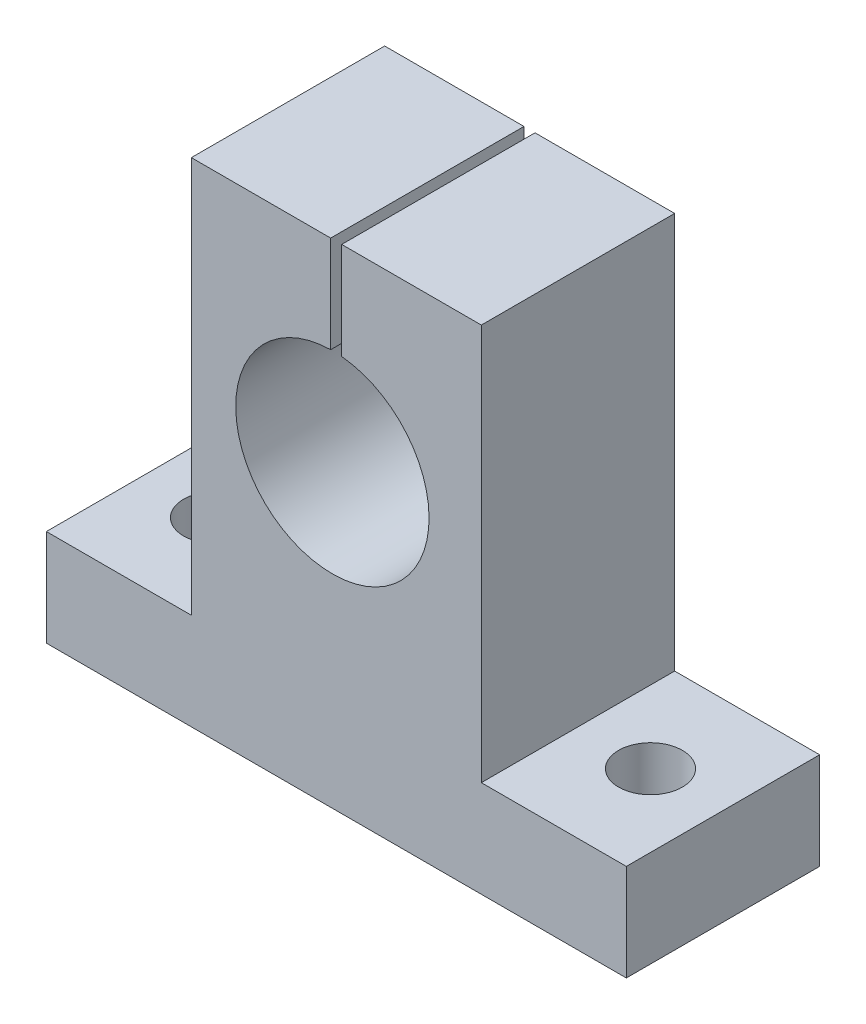
ISO-10303-21;
HEADER;
FILE_DESCRIPTION(('STEP AP214'),'2;1');
FILE_NAME('part.step','',(''),(''),'','','');
FILE_SCHEMA(('AUTOMOTIVE_DESIGN { 1 0 10303 214 1 1 1 1 }'));
ENDSEC;
DATA;
#1=APPLICATION_CONTEXT('core data for automotive mechanical design processes');
#2=APPLICATION_PROTOCOL_DEFINITION('international standard','automotive_design',2000,#1);
#3=PRODUCT_CONTEXT('',#1,'mechanical');
#4=PRODUCT('Part','Part','',(#3));
#5=PRODUCT_RELATED_PRODUCT_CATEGORY('part','',(#4));
#6=PRODUCT_DEFINITION_FORMATION('','',#4);
#7=PRODUCT_DEFINITION_CONTEXT('part definition',#1,'design');
#8=PRODUCT_DEFINITION('design','',#6,#7);
#9=PRODUCT_DEFINITION_SHAPE('','',#8);
#10=(LENGTH_UNIT() NAMED_UNIT(*) SI_UNIT(.MILLI.,.METRE.));
#11=(NAMED_UNIT(*) PLANE_ANGLE_UNIT() SI_UNIT($,.RADIAN.));
#12=(NAMED_UNIT(*) SI_UNIT($,.STERADIAN.) SOLID_ANGLE_UNIT());
#13=UNCERTAINTY_MEASURE_WITH_UNIT(LENGTH_MEASURE(1.E-05),#10,'distance_accuracy_value','');
#14=(GEOMETRIC_REPRESENTATION_CONTEXT(3) GLOBAL_UNCERTAINTY_ASSIGNED_CONTEXT((#13)) GLOBAL_UNIT_ASSIGNED_CONTEXT((#10,
#11,#12)) REPRESENTATION_CONTEXT('',''));
#15=CARTESIAN_POINT('',(0.,0.,0.));
#16=DIRECTION('',(0.,0.,1.));
#17=DIRECTION('',(1.,0.,0.));
#18=AXIS2_PLACEMENT_3D('',#15,#16,#17);
#19=CARTESIAN_POINT('',(-624.635459228669,364.679524851399,14.));
#20=DIRECTION('',(0.,-1.,0.));
#21=DIRECTION('',(0.,0.,-1.));
#22=AXIS2_PLACEMENT_3D('',#19,#20,#21);
#23=PLANE('',#22);
#24=DIRECTION('',(-1.,0.,0.));
#25=VECTOR('',#24,1.);
#26=CARTESIAN_POINT('',(-624.635459228669,364.679524851399,14.));
#27=LINE('',#26,#25);
#28=CARTESIAN_POINT('',(-612.870095692462,364.679524851399,14.));
#29=VERTEX_POINT('',#28);
#30=CARTESIAN_POINT('',(-618.635459228669,364.679524851399,14.));
#31=VERTEX_POINT('',#30);
#32=EDGE_CURVE('E182',#29,#31,#27,.T.);
#33=ORIENTED_EDGE('',*,*,#32,.F.);
#34=DIRECTION('',(0.,0.,1.));
#35=VECTOR('',#34,1.);
#36=CARTESIAN_POINT('',(-612.870095692462,364.679524851399,6.));
#37=LINE('',#36,#35);
#38=CARTESIAN_POINT('',(-612.870095692462,364.679524851399,6.));
#39=VERTEX_POINT('',#38);
#40=EDGE_CURVE('E130',#39,#29,#37,.T.);
#41=ORIENTED_EDGE('',*,*,#40,.F.);
#42=DIRECTION('',(-1.,0.,0.));
#43=VECTOR('',#42,1.);
#44=CARTESIAN_POINT('',(-624.635459228669,364.679524851399,6.));
#45=LINE('',#44,#43);
#46=CARTESIAN_POINT('',(-618.635459228669,364.679524851399,6.));
#47=VERTEX_POINT('',#46);
#48=EDGE_CURVE('E149',#39,#47,#45,.T.);
#49=ORIENTED_EDGE('',*,*,#48,.T.);
#50=DIRECTION('',(0.,0.,1.));
#51=VECTOR('',#50,1.);
#52=CARTESIAN_POINT('',(-618.635459228669,364.679524851399,6.));
#53=LINE('',#52,#51);
#54=EDGE_CURVE('E175',#47,#31,#53,.T.);
#55=ORIENTED_EDGE('',*,*,#54,.T.);
#56=EDGE_LOOP('',(#33,#41,#49,#55));
#57=FACE_BOUND('',#56,.T.);
#58=ADVANCED_FACE('F36',(#57),#23,.F.);
#59=CARTESIAN_POINT('',(-624.635459228669,364.679524851399,14.));
#60=DIRECTION('',(1.,0.,0.));
#61=DIRECTION('',(0.,0.,-1.));
#62=AXIS2_PLACEMENT_3D('',#59,#60,#61);
#63=PLANE('',#62);
#64=DIRECTION('',(0.,-1.,0.));
#65=VECTOR('',#64,1.);
#66=CARTESIAN_POINT('',(-624.635459228669,364.679524851399,14.));
#67=LINE('',#66,#65);
#68=CARTESIAN_POINT('',(-624.635459228669,348.279524851399,14.));
#69=VERTEX_POINT('',#68);
#70=CARTESIAN_POINT('',(-624.635459228669,344.279524851399,14.));
#71=VERTEX_POINT('',#70);
#72=EDGE_CURVE('E148',#69,#71,#67,.T.);
#73=ORIENTED_EDGE('',*,*,#72,.F.);
#74=DIRECTION('',(0.,0.,1.));
#75=VECTOR('',#74,1.);
#76=CARTESIAN_POINT('',(-624.635459228669,348.279524851399,6.));
#77=LINE('',#76,#75);
#78=CARTESIAN_POINT('',(-624.635459228669,348.279524851399,6.));
#79=VERTEX_POINT('',#78);
#80=EDGE_CURVE('E173',#79,#69,#77,.T.);
#81=ORIENTED_EDGE('',*,*,#80,.F.);
#82=DIRECTION('',(0.,-1.,0.));
#83=VECTOR('',#82,1.);
#84=CARTESIAN_POINT('',(-624.635459228669,364.679524851399,6.));
#85=LINE('',#84,#83);
#86=CARTESIAN_POINT('',(-624.635459228669,344.279524851399,6.));
#87=VERTEX_POINT('',#86);
#88=EDGE_CURVE('E172',#79,#87,#85,.T.);
#89=ORIENTED_EDGE('',*,*,#88,.T.);
#90=DIRECTION('',(0.,0.,-1.));
#91=VECTOR('',#90,1.);
#92=CARTESIAN_POINT('',(-624.635459228669,344.279524851399,14.));
#93=LINE('',#92,#91);
#94=EDGE_CURVE('E44',#71,#87,#93,.T.);
#95=ORIENTED_EDGE('',*,*,#94,.F.);
#96=EDGE_LOOP('',(#73,#81,#89,#95));
#97=FACE_BOUND('',#96,.T.);
#98=ADVANCED_FACE('F38',(#97),#63,.F.);
#99=CARTESIAN_POINT('',(-624.635459228669,344.279524851399,14.));
#100=DIRECTION('',(0.,1.,0.));
#101=DIRECTION('',(0.,0.,1.));
#102=AXIS2_PLACEMENT_3D('',#99,#100,#101);
#103=PLANE('',#102);
#104=CARTESIAN_POINT('',(-603.635459228669,344.279524851399,10.));
#105=DIRECTION('',(0.,1.,0.));
#106=DIRECTION('',(0.,0.,1.));
#107=AXIS2_PLACEMENT_3D('',#104,#105,#106);
#108=CIRCLE('',#107,1.31999999999999);
#109=CARTESIAN_POINT('',(-603.635459228669,344.279524851399,11.32));
#110=VERTEX_POINT('',#109);
#111=EDGE_CURVE('E228',#110,#110,#108,.T.);
#112=ORIENTED_EDGE('',*,*,#111,.T.);
#113=EDGE_LOOP('',(#112));
#114=FACE_BOUND('',#113,.T.);
#115=CARTESIAN_POINT('',(-621.635459228669,344.279524851399,10.));
#116=DIRECTION('',(0.,1.,0.));
#117=DIRECTION('',(0.,0.,1.));
#118=AXIS2_PLACEMENT_3D('',#115,#116,#117);
#119=CIRCLE('',#118,1.31999999999999);
#120=CARTESIAN_POINT('',(-621.635459228669,344.279524851399,11.32));
#121=VERTEX_POINT('',#120);
#122=EDGE_CURVE('E221',#121,#121,#119,.T.);
#123=ORIENTED_EDGE('',*,*,#122,.T.);
#124=EDGE_LOOP('',(#123));
#125=FACE_BOUND('',#124,.T.);
#126=DIRECTION('',(1.,0.,0.));
#127=VECTOR('',#126,1.);
#128=CARTESIAN_POINT('',(-624.635459228669,344.279524851399,6.));
#129=LINE('',#128,#127);
#130=CARTESIAN_POINT('',(-600.635459228669,344.279524851399,6.));
#131=VERTEX_POINT('',#130);
#132=EDGE_CURVE('E167',#87,#131,#129,.T.);
#133=ORIENTED_EDGE('',*,*,#132,.T.);
#134=DIRECTION('',(0.,0.,-1.));
#135=VECTOR('',#134,1.);
#136=CARTESIAN_POINT('',(-600.635459228669,344.279524851399,14.));
#137=LINE('',#136,#135);
#138=CARTESIAN_POINT('',(-600.635459228669,344.279524851399,14.));
#139=VERTEX_POINT('',#138);
#140=EDGE_CURVE('E157',#139,#131,#137,.T.);
#141=ORIENTED_EDGE('',*,*,#140,.F.);
#142=DIRECTION('',(1.,0.,0.));
#143=VECTOR('',#142,1.);
#144=CARTESIAN_POINT('',(-624.635459228669,344.279524851399,14.));
#145=LINE('',#144,#143);
#146=EDGE_CURVE('E151',#71,#139,#145,.T.);
#147=ORIENTED_EDGE('',*,*,#146,.F.);
#148=ORIENTED_EDGE('',*,*,#94,.T.);
#149=EDGE_LOOP('',(#133,#141,#147,#148));
#150=FACE_BOUND('',#149,.T.);
#151=ADVANCED_FACE('F164',(#114,#125,#150),#103,.F.);
#152=CARTESIAN_POINT('',(-600.635459228669,364.679524851399,14.));
#153=DIRECTION('',(-1.,0.,0.));
#154=DIRECTION('',(0.,-1.,0.));
#155=AXIS2_PLACEMENT_3D('',#152,#153,#154);
#156=PLANE('',#155);
#157=DIRECTION('',(0.,1.,0.));
#158=VECTOR('',#157,1.);
#159=CARTESIAN_POINT('',(-600.635459228669,364.679524851399,6.));
#160=LINE('',#159,#158);
#161=CARTESIAN_POINT('',(-600.635459228669,348.279524851399,6.));
#162=VERTEX_POINT('',#161);
#163=EDGE_CURVE('E153',#131,#162,#160,.T.);
#164=ORIENTED_EDGE('',*,*,#163,.T.);
#165=DIRECTION('',(0.,0.,1.));
#166=VECTOR('',#165,1.);
#167=CARTESIAN_POINT('',(-600.635459228669,348.279524851399,6.));
#168=LINE('',#167,#166);
#169=CARTESIAN_POINT('',(-600.635459228669,348.279524851399,14.));
#170=VERTEX_POINT('',#169);
#171=EDGE_CURVE('E200',#162,#170,#168,.T.);
#172=ORIENTED_EDGE('',*,*,#171,.T.);
#173=DIRECTION('',(0.,1.,0.));
#174=VECTOR('',#173,1.);
#175=CARTESIAN_POINT('',(-600.635459228669,364.679524851399,14.));
#176=LINE('',#175,#174);
#177=EDGE_CURVE('E183',#139,#170,#176,.T.);
#178=ORIENTED_EDGE('',*,*,#177,.F.);
#179=ORIENTED_EDGE('',*,*,#140,.T.);
#180=EDGE_LOOP('',(#164,#172,#178,#179));
#181=FACE_BOUND('',#180,.T.);
#182=ADVANCED_FACE('F251',(#181),#156,.F.);
#183=CARTESIAN_POINT('',(-606.635459228669,364.679524851399,6.));
#184=VERTEX_POINT('',#183);
#185=CARTESIAN_POINT('',(-612.413371158243,364.679524851399,6.));
#186=VERTEX_POINT('',#185);
#187=EDGE_CURVE('E139',#184,#186,#45,.T.);
#188=ORIENTED_EDGE('',*,*,#187,.T.);
#189=DIRECTION('',(0.,0.,1.));
#190=VECTOR('',#189,1.);
#191=CARTESIAN_POINT('',(-612.413371158243,364.679524851399,6.));
#192=LINE('',#191,#190);
#193=CARTESIAN_POINT('',(-612.413371158243,364.679524851399,14.));
#194=VERTEX_POINT('',#193);
#195=EDGE_CURVE('E122',#186,#194,#192,.T.);
#196=ORIENTED_EDGE('',*,*,#195,.T.);
#197=CARTESIAN_POINT('',(-606.635459228669,364.679524851399,14.));
#198=VERTEX_POINT('',#197);
#199=EDGE_CURVE('E159',#198,#194,#27,.T.);
#200=ORIENTED_EDGE('',*,*,#199,.F.);
#201=DIRECTION('',(0.,0.,1.));
#202=VECTOR('',#201,1.);
#203=CARTESIAN_POINT('',(-606.635459228669,364.679524851399,6.));
#204=LINE('',#203,#202);
#205=EDGE_CURVE('E147',#184,#198,#204,.T.);
#206=ORIENTED_EDGE('',*,*,#205,.F.);
#207=EDGE_LOOP('',(#188,#196,#200,#206));
#208=FACE_BOUND('',#207,.T.);
#209=ADVANCED_FACE('F146',(#208),#23,.F.);
#210=CARTESIAN_POINT('',(-367.560360414439,211.477943823731,14.));
#211=DIRECTION('',(0.,0.,1.));
#212=DIRECTION('',(1.,0.,0.));
#213=AXIS2_PLACEMENT_3D('',#210,#211,#212);
#214=PLANE('',#213);
#215=DIRECTION('',(0.,-1.,0.));
#216=VECTOR('',#215,1.);
#217=CARTESIAN_POINT('',(-612.870095692462,364.679524851399,14.));
#218=LINE('',#217,#216);
#219=CARTESIAN_POINT('',(-612.870095692462,360.678881679723,14.));
#220=VERTEX_POINT('',#219);
#221=EDGE_CURVE('E51',#29,#220,#218,.T.);
#222=ORIENTED_EDGE('',*,*,#221,.F.);
#223=ORIENTED_EDGE('',*,*,#32,.T.);
#224=DIRECTION('',(0.,1.,0.));
#225=VECTOR('',#224,1.);
#226=CARTESIAN_POINT('',(-618.635459228669,364.679524851399,14.));
#227=LINE('',#226,#225);
#228=CARTESIAN_POINT('',(-618.635459228669,348.279524851399,14.));
#229=VERTEX_POINT('',#228);
#230=EDGE_CURVE('E193',#229,#31,#227,.T.);
#231=ORIENTED_EDGE('',*,*,#230,.F.);
#232=DIRECTION('',(1.,0.,0.));
#233=VECTOR('',#232,1.);
#234=CARTESIAN_POINT('',(-624.635459228669,348.279524851399,14.));
#235=LINE('',#234,#233);
#236=EDGE_CURVE('E197',#69,#229,#235,.T.);
#237=ORIENTED_EDGE('',*,*,#236,.F.);
#238=ORIENTED_EDGE('',*,*,#72,.T.);
#239=ORIENTED_EDGE('',*,*,#146,.T.);
#240=ORIENTED_EDGE('',*,*,#177,.T.);
#241=DIRECTION('',(1.,0.,0.));
#242=VECTOR('',#241,1.);
#243=CARTESIAN_POINT('',(-600.635459228669,348.279524851399,14.));
#244=LINE('',#243,#242);
#245=CARTESIAN_POINT('',(-606.635459228669,348.279524851399,14.));
#246=VERTEX_POINT('',#245);
#247=EDGE_CURVE('E210',#246,#170,#244,.T.);
#248=ORIENTED_EDGE('',*,*,#247,.F.);
#249=DIRECTION('',(0.,-1.,0.));
#250=VECTOR('',#249,1.);
#251=CARTESIAN_POINT('',(-606.635459228669,364.679524851399,14.));
#252=LINE('',#251,#250);
#253=EDGE_CURVE('E213',#198,#246,#252,.T.);
#254=ORIENTED_EDGE('',*,*,#253,.F.);
#255=ORIENTED_EDGE('',*,*,#199,.T.);
#256=DIRECTION('',(0.,1.,0.));
#257=VECTOR('',#256,1.);
#258=CARTESIAN_POINT('',(-612.413371158243,364.679524851399,14.));
#259=LINE('',#258,#257);
#260=CARTESIAN_POINT('',(-612.413371158243,360.660953986418,14.));
#261=VERTEX_POINT('',#260);
#262=EDGE_CURVE('E125',#261,#194,#259,.T.);
#263=ORIENTED_EDGE('',*,*,#262,.F.);
#264=CARTESIAN_POINT('',(-612.798367317736,356.679524851399,14.));
#265=DIRECTION('',(0.,0.,1.));
#266=DIRECTION('',(1.,0.,0.));
#267=AXIS2_PLACEMENT_3D('',#264,#265,#266);
#268=CIRCLE('',#267,3.99999999999999);
#269=EDGE_CURVE('E218',#220,#261,#268,.T.);
#270=ORIENTED_EDGE('',*,*,#269,.F.);
#271=EDGE_LOOP('',(#222,#223,#231,#237,#238,#239,#240,#248,#254,#255,#263,#270));
#272=FACE_BOUND('',#271,.T.);
#273=ADVANCED_FACE('F243',(#272),#214,.T.);
#274=CARTESIAN_POINT('',(-367.560360414439,211.477943823731,6.));
#275=DIRECTION('',(0.,0.,1.));
#276=DIRECTION('',(1.,0.,0.));
#277=AXIS2_PLACEMENT_3D('',#274,#275,#276);
#278=PLANE('',#277);
#279=ORIENTED_EDGE('',*,*,#48,.F.);
#280=DIRECTION('',(0.,-1.,0.));
#281=VECTOR('',#280,1.);
#282=CARTESIAN_POINT('',(-612.870095692462,364.679524851399,6.));
#283=LINE('',#282,#281);
#284=CARTESIAN_POINT('',(-612.870095692462,360.678881679723,6.));
#285=VERTEX_POINT('',#284);
#286=EDGE_CURVE('E143',#39,#285,#283,.T.);
#287=ORIENTED_EDGE('',*,*,#286,.T.);
#288=CARTESIAN_POINT('',(-612.798367317736,356.679524851399,6.));
#289=DIRECTION('',(0.,0.,1.));
#290=DIRECTION('',(1.,0.,0.));
#291=AXIS2_PLACEMENT_3D('',#288,#289,#290);
#292=CIRCLE('',#291,3.99999999999999);
#293=CARTESIAN_POINT('',(-612.413371158244,360.660953986418,6.));
#294=VERTEX_POINT('',#293);
#295=EDGE_CURVE('E142',#285,#294,#292,.T.);
#296=ORIENTED_EDGE('',*,*,#295,.T.);
#297=DIRECTION('',(0.,1.,0.));
#298=VECTOR('',#297,1.);
#299=CARTESIAN_POINT('',(-612.413371158243,364.679524851399,6.));
#300=LINE('',#299,#298);
#301=EDGE_CURVE('E58',#294,#186,#300,.T.);
#302=ORIENTED_EDGE('',*,*,#301,.T.);
#303=ORIENTED_EDGE('',*,*,#187,.F.);
#304=DIRECTION('',(0.,-1.,0.));
#305=VECTOR('',#304,1.);
#306=CARTESIAN_POINT('',(-606.635459228669,364.679524851399,6.));
#307=LINE('',#306,#305);
#308=CARTESIAN_POINT('',(-606.635459228669,348.279524851399,6.));
#309=VERTEX_POINT('',#308);
#310=EDGE_CURVE('E212',#184,#309,#307,.T.);
#311=ORIENTED_EDGE('',*,*,#310,.T.);
#312=DIRECTION('',(1.,0.,0.));
#313=VECTOR('',#312,1.);
#314=CARTESIAN_POINT('',(-600.635459228669,348.279524851399,6.));
#315=LINE('',#314,#313);
#316=EDGE_CURVE('E206',#309,#162,#315,.T.);
#317=ORIENTED_EDGE('',*,*,#316,.T.);
#318=ORIENTED_EDGE('',*,*,#163,.F.);
#319=ORIENTED_EDGE('',*,*,#132,.F.);
#320=ORIENTED_EDGE('',*,*,#88,.F.);
#321=DIRECTION('',(1.,0.,0.));
#322=VECTOR('',#321,1.);
#323=CARTESIAN_POINT('',(-624.635459228669,348.279524851399,6.));
#324=LINE('',#323,#322);
#325=CARTESIAN_POINT('',(-618.635459228669,348.279524851399,6.));
#326=VERTEX_POINT('',#325);
#327=EDGE_CURVE('E196',#79,#326,#324,.T.);
#328=ORIENTED_EDGE('',*,*,#327,.T.);
#329=DIRECTION('',(0.,1.,0.));
#330=VECTOR('',#329,1.);
#331=CARTESIAN_POINT('',(-618.635459228669,364.679524851399,6.));
#332=LINE('',#331,#330);
#333=EDGE_CURVE('E189',#326,#47,#332,.T.);
#334=ORIENTED_EDGE('',*,*,#333,.T.);
#335=EDGE_LOOP('',(#279,#287,#296,#302,#303,#311,#317,#318,#319,#320,#328,#334));
#336=FACE_BOUND('',#335,.T.);
#337=ADVANCED_FACE('F137',(#336),#278,.F.);
#338=CARTESIAN_POINT('',(-618.635459228669,364.679524851399,6.));
#339=DIRECTION('',(1.,0.,0.));
#340=DIRECTION('',(0.,0.,-1.));
#341=AXIS2_PLACEMENT_3D('',#338,#339,#340);
#342=PLANE('',#341);
#343=ORIENTED_EDGE('',*,*,#230,.T.);
#344=ORIENTED_EDGE('',*,*,#54,.F.);
#345=ORIENTED_EDGE('',*,*,#333,.F.);
#346=DIRECTION('',(0.,0.,1.));
#347=VECTOR('',#346,1.);
#348=CARTESIAN_POINT('',(-618.635459228669,348.279524851399,6.));
#349=LINE('',#348,#347);
#350=EDGE_CURVE('E188',#326,#229,#349,.T.);
#351=ORIENTED_EDGE('',*,*,#350,.T.);
#352=EDGE_LOOP('',(#343,#344,#345,#351));
#353=FACE_BOUND('',#352,.T.);
#354=ADVANCED_FACE('F260',(#353),#342,.F.);
#355=CARTESIAN_POINT('',(-624.635459228669,348.279524851399,6.));
#356=DIRECTION('',(0.,-1.,0.));
#357=DIRECTION('',(0.,0.,-1.));
#358=AXIS2_PLACEMENT_3D('',#355,#356,#357);
#359=PLANE('',#358);
#360=CARTESIAN_POINT('',(-621.635459228669,348.279524851399,10.));
#361=DIRECTION('',(0.,1.,0.));
#362=DIRECTION('',(0.,0.,1.));
#363=AXIS2_PLACEMENT_3D('',#360,#361,#362);
#364=CIRCLE('',#363,1.31999999999999);
#365=CARTESIAN_POINT('',(-621.635459228669,348.279524851399,11.32));
#366=VERTEX_POINT('',#365);
#367=EDGE_CURVE('E225',#366,#366,#364,.T.);
#368=ORIENTED_EDGE('',*,*,#367,.F.);
#369=EDGE_LOOP('',(#368));
#370=FACE_BOUND('',#369,.T.);
#371=ORIENTED_EDGE('',*,*,#236,.T.);
#372=ORIENTED_EDGE('',*,*,#350,.F.);
#373=ORIENTED_EDGE('',*,*,#327,.F.);
#374=ORIENTED_EDGE('',*,*,#80,.T.);
#375=EDGE_LOOP('',(#371,#372,#373,#374));
#376=FACE_BOUND('',#375,.T.);
#377=ADVANCED_FACE('F257',(#370,#376),#359,.F.);
#378=CARTESIAN_POINT('',(-600.635459228669,348.279524851399,6.));
#379=DIRECTION('',(0.,-1.,0.));
#380=DIRECTION('',(0.,0.,-1.));
#381=AXIS2_PLACEMENT_3D('',#378,#379,#380);
#382=PLANE('',#381);
#383=CARTESIAN_POINT('',(-603.635459228669,348.279524851399,10.));
#384=DIRECTION('',(0.,1.,0.));
#385=DIRECTION('',(0.,0.,1.));
#386=AXIS2_PLACEMENT_3D('',#383,#384,#385);
#387=CIRCLE('',#386,1.31999999999999);
#388=CARTESIAN_POINT('',(-603.635459228669,348.279524851399,11.32));
#389=VERTEX_POINT('',#388);
#390=EDGE_CURVE('E231',#389,#389,#387,.T.);
#391=ORIENTED_EDGE('',*,*,#390,.F.);
#392=EDGE_LOOP('',(#391));
#393=FACE_BOUND('',#392,.T.);
#394=ORIENTED_EDGE('',*,*,#247,.T.);
#395=ORIENTED_EDGE('',*,*,#171,.F.);
#396=ORIENTED_EDGE('',*,*,#316,.F.);
#397=DIRECTION('',(0.,0.,1.));
#398=VECTOR('',#397,1.);
#399=CARTESIAN_POINT('',(-606.635459228669,348.279524851399,6.));
#400=LINE('',#399,#398);
#401=EDGE_CURVE('E205',#309,#246,#400,.T.);
#402=ORIENTED_EDGE('',*,*,#401,.T.);
#403=EDGE_LOOP('',(#394,#395,#396,#402));
#404=FACE_BOUND('',#403,.T.);
#405=ADVANCED_FACE('F306',(#393,#404),#382,.F.);
#406=CARTESIAN_POINT('',(-606.635459228669,364.679524851399,6.));
#407=DIRECTION('',(-1.,0.,0.));
#408=DIRECTION('',(0.,0.,1.));
#409=AXIS2_PLACEMENT_3D('',#406,#407,#408);
#410=PLANE('',#409);
#411=ORIENTED_EDGE('',*,*,#253,.T.);
#412=ORIENTED_EDGE('',*,*,#401,.F.);
#413=ORIENTED_EDGE('',*,*,#310,.F.);
#414=ORIENTED_EDGE('',*,*,#205,.T.);
#415=EDGE_LOOP('',(#411,#412,#413,#414));
#416=FACE_BOUND('',#415,.T.);
#417=ADVANCED_FACE('F248',(#416),#410,.F.);
#418=CARTESIAN_POINT('',(-612.798367317736,356.679524851399,6.));
#419=DIRECTION('',(0.,0.,1.));
#420=DIRECTION('',(1.,0.,0.));
#421=AXIS2_PLACEMENT_3D('',#418,#419,#420);
#422=CYLINDRICAL_SURFACE('',#421,3.99999999999999);
#423=ORIENTED_EDGE('',*,*,#295,.F.);
#424=DIRECTION('',(0.,0.,1.));
#425=VECTOR('',#424,1.);
#426=CARTESIAN_POINT('',(-612.870095692462,360.678881679723,6.));
#427=LINE('',#426,#425);
#428=EDGE_CURVE('E11',#285,#220,#427,.T.);
#429=ORIENTED_EDGE('',*,*,#428,.T.);
#430=ORIENTED_EDGE('',*,*,#269,.T.);
#431=DIRECTION('',(0.,0.,1.));
#432=VECTOR('',#431,1.);
#433=CARTESIAN_POINT('',(-612.413371158243,360.660953986418,6.));
#434=LINE('',#433,#432);
#435=EDGE_CURVE('E131',#294,#261,#434,.T.);
#436=ORIENTED_EDGE('',*,*,#435,.F.);
#437=EDGE_LOOP('',(#423,#429,#430,#436));
#438=FACE_BOUND('',#437,.T.);
#439=ADVANCED_FACE('F240',(#438),#422,.F.);
#440=CARTESIAN_POINT('',(-621.635459228669,340.279524851399,10.));
#441=DIRECTION('',(0.,1.,0.));
#442=DIRECTION('',(0.,0.,1.));
#443=AXIS2_PLACEMENT_3D('',#440,#441,#442);
#444=CYLINDRICAL_SURFACE('',#443,1.31999999999999);
#445=ORIENTED_EDGE('',*,*,#367,.T.);
#446=EDGE_LOOP('',(#445));
#447=FACE_BOUND('',#446,.T.);
#448=ORIENTED_EDGE('',*,*,#122,.F.);
#449=EDGE_LOOP('',(#448));
#450=FACE_BOUND('',#449,.T.);
#451=ADVANCED_FACE('F295',(#447,#450),#444,.F.);
#452=CARTESIAN_POINT('',(-603.635459228669,340.279524851399,10.));
#453=DIRECTION('',(0.,1.,0.));
#454=DIRECTION('',(0.,0.,1.));
#455=AXIS2_PLACEMENT_3D('',#452,#453,#454);
#456=CYLINDRICAL_SURFACE('',#455,1.31999999999999);
#457=ORIENTED_EDGE('',*,*,#390,.T.);
#458=EDGE_LOOP('',(#457));
#459=FACE_BOUND('',#458,.T.);
#460=ORIENTED_EDGE('',*,*,#111,.F.);
#461=EDGE_LOOP('',(#460));
#462=FACE_BOUND('',#461,.T.);
#463=ADVANCED_FACE('F269',(#459,#462),#456,.F.);
#464=CARTESIAN_POINT('',(-612.413371158243,364.679524851399,6.));
#465=DIRECTION('',(1.,0.,0.));
#466=DIRECTION('',(0.,0.,-1.));
#467=AXIS2_PLACEMENT_3D('',#464,#465,#466);
#468=PLANE('',#467);
#469=ORIENTED_EDGE('',*,*,#262,.T.);
#470=ORIENTED_EDGE('',*,*,#195,.F.);
#471=ORIENTED_EDGE('',*,*,#301,.F.);
#472=ORIENTED_EDGE('',*,*,#435,.T.);
#473=EDGE_LOOP('',(#469,#470,#471,#472));
#474=FACE_BOUND('',#473,.T.);
#475=ADVANCED_FACE('F123',(#474),#468,.F.);
#476=CARTESIAN_POINT('',(-612.870095692462,364.679524851399,6.));
#477=DIRECTION('',(-1.,0.,0.));
#478=DIRECTION('',(0.,0.,1.));
#479=AXIS2_PLACEMENT_3D('',#476,#477,#478);
#480=PLANE('',#479);
#481=ORIENTED_EDGE('',*,*,#286,.F.);
#482=ORIENTED_EDGE('',*,*,#40,.T.);
#483=ORIENTED_EDGE('',*,*,#221,.T.);
#484=ORIENTED_EDGE('',*,*,#428,.F.);
#485=EDGE_LOOP('',(#481,#482,#483,#484));
#486=FACE_BOUND('',#485,.T.);
#487=ADVANCED_FACE('F263',(#486),#480,.F.);
#488=CLOSED_SHELL('',(#58,#98,#151,#182,#209,#273,#337,#354,#377,#405,#417,#439,#451,#463,#475,#487));
#489=MANIFOLD_SOLID_BREP('B2',#488);
#490=ADVANCED_BREP_SHAPE_REPRESENTATION('',(#18,#489),#14);
#491=SHAPE_DEFINITION_REPRESENTATION(#9,#490);
ENDSEC;
END-ISO-10303-21;
